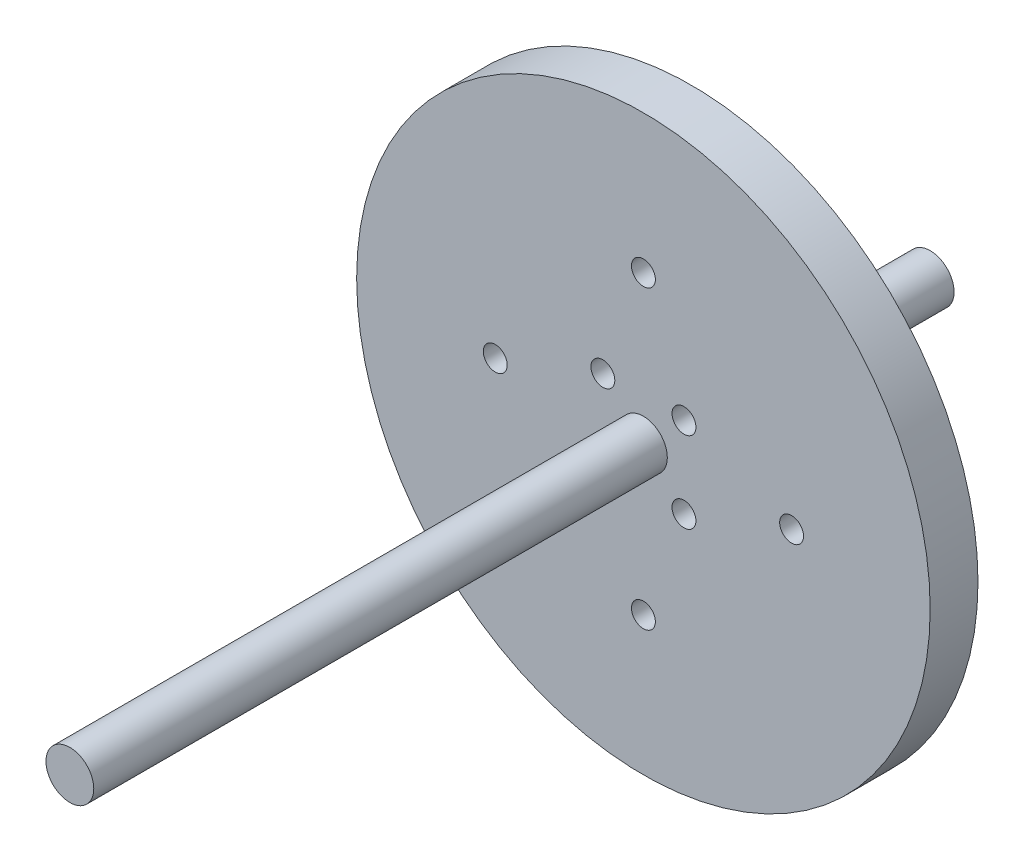
ISO-10303-21;
HEADER;
FILE_DESCRIPTION(('STEP AP214'),'2;1');
FILE_NAME('part.step','',(''),(''),'','','');
FILE_SCHEMA(('AUTOMOTIVE_DESIGN { 1 0 10303 214 1 1 1 1 }'));
ENDSEC;
DATA;
#1=APPLICATION_CONTEXT('core data for automotive mechanical design processes');
#2=APPLICATION_PROTOCOL_DEFINITION('international standard','automotive_design',2000,#1);
#3=PRODUCT_CONTEXT('',#1,'mechanical');
#4=PRODUCT('Part','Part','',(#3));
#5=PRODUCT_RELATED_PRODUCT_CATEGORY('part','',(#4));
#6=PRODUCT_DEFINITION_FORMATION('','',#4);
#7=PRODUCT_DEFINITION_CONTEXT('part definition',#1,'design');
#8=PRODUCT_DEFINITION('design','',#6,#7);
#9=PRODUCT_DEFINITION_SHAPE('','',#8);
#10=(LENGTH_UNIT() NAMED_UNIT(*) SI_UNIT(.MILLI.,.METRE.));
#11=(NAMED_UNIT(*) PLANE_ANGLE_UNIT() SI_UNIT($,.RADIAN.));
#12=(NAMED_UNIT(*) SI_UNIT($,.STERADIAN.) SOLID_ANGLE_UNIT());
#13=UNCERTAINTY_MEASURE_WITH_UNIT(LENGTH_MEASURE(1.E-05),#10,'distance_accuracy_value','');
#14=(GEOMETRIC_REPRESENTATION_CONTEXT(3) GLOBAL_UNCERTAINTY_ASSIGNED_CONTEXT((#13)) GLOBAL_UNIT_ASSIGNED_CONTEXT((#10,
#11,#12)) REPRESENTATION_CONTEXT('',''));
#15=CARTESIAN_POINT('',(0.,0.,0.));
#16=DIRECTION('',(0.,0.,1.));
#17=DIRECTION('',(1.,0.,0.));
#18=AXIS2_PLACEMENT_3D('',#15,#16,#17);
#19=CARTESIAN_POINT('',(0.,0.,5.));
#20=DIRECTION('',(0.,0.,-1.));
#21=DIRECTION('',(-1.,0.,0.));
#22=AXIS2_PLACEMENT_3D('',#19,#20,#21);
#23=CYLINDRICAL_SURFACE('',#22,30.);
#24=CARTESIAN_POINT('',(0.,0.,5.));
#25=DIRECTION('',(0.,0.,1.));
#26=DIRECTION('',(1.,0.,0.));
#27=AXIS2_PLACEMENT_3D('',#24,#25,#26);
#28=CIRCLE('',#27,30.);
#29=CARTESIAN_POINT('',(30.,0.,5.));
#30=VERTEX_POINT('',#29);
#31=EDGE_CURVE('E41',#30,#30,#28,.T.);
#32=ORIENTED_EDGE('',*,*,#31,.F.);
#33=EDGE_LOOP('',(#32));
#34=FACE_BOUND('',#33,.T.);
#35=CARTESIAN_POINT('',(0.,0.,0.));
#36=DIRECTION('',(0.,0.,1.));
#37=DIRECTION('',(1.,0.,0.));
#38=AXIS2_PLACEMENT_3D('',#35,#36,#37);
#39=CIRCLE('',#38,30.);
#40=CARTESIAN_POINT('',(30.,0.,0.));
#41=VERTEX_POINT('',#40);
#42=EDGE_CURVE('E45',#41,#41,#39,.T.);
#43=ORIENTED_EDGE('',*,*,#42,.T.);
#44=EDGE_LOOP('',(#43));
#45=FACE_BOUND('',#44,.T.);
#46=ADVANCED_FACE('F35',(#34,#45),#23,.T.);
#47=CARTESIAN_POINT('',(0.,0.,5.));
#48=DIRECTION('',(0.,0.,1.));
#49=DIRECTION('',(1.,0.,0.));
#50=AXIS2_PLACEMENT_3D('',#47,#48,#49);
#51=PLANE('',#50);
#52=CARTESIAN_POINT('',(0.,0.,5.));
#53=DIRECTION('',(0.,0.,1.));
#54=DIRECTION('',(1.,0.,0.));
#55=AXIS2_PLACEMENT_3D('',#52,#53,#54);
#56=CIRCLE('',#55,2.5);
#57=CARTESIAN_POINT('',(2.5,0.,5.));
#58=VERTEX_POINT('',#57);
#59=EDGE_CURVE('E103',#58,#58,#56,.T.);
#60=ORIENTED_EDGE('',*,*,#59,.F.);
#61=EDGE_LOOP('',(#60));
#62=FACE_BOUND('',#61,.T.);
#63=CARTESIAN_POINT('',(0.,15.5,5.));
#64=DIRECTION('',(0.,0.,1.));
#65=DIRECTION('',(1.,0.,0.));
#66=AXIS2_PLACEMENT_3D('',#63,#64,#65);
#67=CIRCLE('',#66,1.25);
#68=CARTESIAN_POINT('',(1.25,15.5,5.));
#69=VERTEX_POINT('',#68);
#70=EDGE_CURVE('E77',#69,#69,#67,.T.);
#71=ORIENTED_EDGE('',*,*,#70,.F.);
#72=EDGE_LOOP('',(#71));
#73=FACE_BOUND('',#72,.T.);
#74=CARTESIAN_POINT('',(-4.24264068711914,4.24264068711909,5.));
#75=DIRECTION('',(0.,0.,1.));
#76=DIRECTION('',(1.,0.,0.));
#77=AXIS2_PLACEMENT_3D('',#74,#75,#76);
#78=CIRCLE('',#77,1.25);
#79=CARTESIAN_POINT('',(-2.99264068711914,4.24264068711909,5.));
#80=VERTEX_POINT('',#79);
#81=EDGE_CURVE('E81',#80,#80,#78,.T.);
#82=ORIENTED_EDGE('',*,*,#81,.F.);
#83=EDGE_LOOP('',(#82));
#84=FACE_BOUND('',#83,.T.);
#85=CARTESIAN_POINT('',(-4.24264068711892,-4.24264068711931,5.));
#86=DIRECTION('',(0.,0.,1.));
#87=DIRECTION('',(1.,0.,0.));
#88=AXIS2_PLACEMENT_3D('',#85,#86,#87);
#89=CIRCLE('',#88,1.25);
#90=CARTESIAN_POINT('',(-2.99264068711892,-4.24264068711931,5.));
#91=VERTEX_POINT('',#90);
#92=EDGE_CURVE('E88',#91,#91,#89,.T.);
#93=ORIENTED_EDGE('',*,*,#92,.F.);
#94=EDGE_LOOP('',(#93));
#95=FACE_BOUND('',#94,.T.);
#96=CARTESIAN_POINT('',(4.24264068711948,-4.24264068711909,5.));
#97=DIRECTION('',(0.,0.,1.));
#98=DIRECTION('',(1.,0.,0.));
#99=AXIS2_PLACEMENT_3D('',#96,#97,#98);
#100=CIRCLE('',#99,1.25);
#101=CARTESIAN_POINT('',(5.49264068711948,-4.24264068711909,5.));
#102=VERTEX_POINT('',#101);
#103=EDGE_CURVE('E56',#102,#102,#100,.T.);
#104=ORIENTED_EDGE('',*,*,#103,.F.);
#105=EDGE_LOOP('',(#104));
#106=FACE_BOUND('',#105,.T.);
#107=CARTESIAN_POINT('',(-15.5,0.,5.));
#108=DIRECTION('',(0.,0.,1.));
#109=DIRECTION('',(1.,0.,0.));
#110=AXIS2_PLACEMENT_3D('',#107,#108,#109);
#111=CIRCLE('',#110,1.25);
#112=CARTESIAN_POINT('',(-14.25,0.,5.));
#113=VERTEX_POINT('',#112);
#114=EDGE_CURVE('E55',#113,#113,#111,.T.);
#115=ORIENTED_EDGE('',*,*,#114,.F.);
#116=EDGE_LOOP('',(#115));
#117=FACE_BOUND('',#116,.T.);
#118=CARTESIAN_POINT('',(0.,-15.5,5.));
#119=DIRECTION('',(0.,0.,1.));
#120=DIRECTION('',(1.,0.,0.));
#121=AXIS2_PLACEMENT_3D('',#118,#119,#120);
#122=CIRCLE('',#121,1.25);
#123=CARTESIAN_POINT('',(1.25000000000001,-15.5,5.));
#124=VERTEX_POINT('',#123);
#125=EDGE_CURVE('E62',#124,#124,#122,.T.);
#126=ORIENTED_EDGE('',*,*,#125,.F.);
#127=EDGE_LOOP('',(#126));
#128=FACE_BOUND('',#127,.T.);
#129=CARTESIAN_POINT('',(15.5,0.,5.));
#130=DIRECTION('',(0.,0.,1.));
#131=DIRECTION('',(1.,0.,0.));
#132=AXIS2_PLACEMENT_3D('',#129,#130,#131);
#133=CIRCLE('',#132,1.25);
#134=CARTESIAN_POINT('',(16.75,0.,5.));
#135=VERTEX_POINT('',#134);
#136=EDGE_CURVE('E68',#135,#135,#133,.T.);
#137=ORIENTED_EDGE('',*,*,#136,.F.);
#138=EDGE_LOOP('',(#137));
#139=FACE_BOUND('',#138,.T.);
#140=CARTESIAN_POINT('',(4.24264068711926,4.24264068711931,5.));
#141=DIRECTION('',(0.,0.,1.));
#142=DIRECTION('',(1.,0.,0.));
#143=AXIS2_PLACEMENT_3D('',#140,#141,#142);
#144=CIRCLE('',#143,1.25);
#145=CARTESIAN_POINT('',(5.49264068711926,4.24264068711931,5.));
#146=VERTEX_POINT('',#145);
#147=EDGE_CURVE('E74',#146,#146,#144,.T.);
#148=ORIENTED_EDGE('',*,*,#147,.F.);
#149=EDGE_LOOP('',(#148));
#150=FACE_BOUND('',#149,.T.);
#151=ORIENTED_EDGE('',*,*,#31,.T.);
#152=EDGE_LOOP('',(#151));
#153=FACE_BOUND('',#152,.T.);
#154=ADVANCED_FACE('F118',(#62,#73,#84,#95,#106,#117,#128,#139,#150,#153),#51,.T.);
#155=CARTESIAN_POINT('',(0.,0.,0.));
#156=DIRECTION('',(0.,0.,1.));
#157=DIRECTION('',(1.,0.,0.));
#158=AXIS2_PLACEMENT_3D('',#155,#156,#157);
#159=PLANE('',#158);
#160=CARTESIAN_POINT('',(0.,0.,0.));
#161=DIRECTION('',(0.,0.,1.));
#162=DIRECTION('',(1.,0.,0.));
#163=AXIS2_PLACEMENT_3D('',#160,#161,#162);
#164=CIRCLE('',#163,2.5);
#165=CARTESIAN_POINT('',(2.5,0.,0.));
#166=VERTEX_POINT('',#165);
#167=EDGE_CURVE('E10',#166,#166,#164,.F.);
#168=ORIENTED_EDGE('',*,*,#167,.F.);
#169=EDGE_LOOP('',(#168));
#170=FACE_BOUND('',#169,.T.);
#171=CARTESIAN_POINT('',(0.,15.5,0.));
#172=DIRECTION('',(0.,0.,1.));
#173=DIRECTION('',(1.,0.,0.));
#174=AXIS2_PLACEMENT_3D('',#171,#172,#173);
#175=CIRCLE('',#174,1.25);
#176=CARTESIAN_POINT('',(1.25,15.5,0.));
#177=VERTEX_POINT('',#176);
#178=EDGE_CURVE('E50',#177,#177,#175,.T.);
#179=ORIENTED_EDGE('',*,*,#178,.T.);
#180=EDGE_LOOP('',(#179));
#181=FACE_BOUND('',#180,.T.);
#182=CARTESIAN_POINT('',(-4.24264068711914,4.24264068711909,0.));
#183=DIRECTION('',(0.,0.,1.));
#184=DIRECTION('',(1.,0.,0.));
#185=AXIS2_PLACEMENT_3D('',#182,#183,#184);
#186=CIRCLE('',#185,1.25);
#187=CARTESIAN_POINT('',(-2.99264068711914,4.24264068711909,0.));
#188=VERTEX_POINT('',#187);
#189=EDGE_CURVE('E78',#188,#188,#186,.T.);
#190=ORIENTED_EDGE('',*,*,#189,.T.);
#191=EDGE_LOOP('',(#190));
#192=FACE_BOUND('',#191,.T.);
#193=CARTESIAN_POINT('',(-4.24264068711892,-4.24264068711931,0.));
#194=DIRECTION('',(0.,0.,1.));
#195=DIRECTION('',(1.,0.,0.));
#196=AXIS2_PLACEMENT_3D('',#193,#194,#195);
#197=CIRCLE('',#196,1.25);
#198=CARTESIAN_POINT('',(-2.99264068711892,-4.24264068711931,0.));
#199=VERTEX_POINT('',#198);
#200=EDGE_CURVE('E85',#199,#199,#197,.T.);
#201=ORIENTED_EDGE('',*,*,#200,.T.);
#202=EDGE_LOOP('',(#201));
#203=FACE_BOUND('',#202,.T.);
#204=CARTESIAN_POINT('',(4.24264068711948,-4.24264068711909,0.));
#205=DIRECTION('',(0.,0.,1.));
#206=DIRECTION('',(1.,0.,0.));
#207=AXIS2_PLACEMENT_3D('',#204,#205,#206);
#208=CIRCLE('',#207,1.25);
#209=CARTESIAN_POINT('',(5.49264068711948,-4.24264068711909,0.));
#210=VERTEX_POINT('',#209);
#211=EDGE_CURVE('E91',#210,#210,#208,.T.);
#212=ORIENTED_EDGE('',*,*,#211,.T.);
#213=EDGE_LOOP('',(#212));
#214=FACE_BOUND('',#213,.T.);
#215=CARTESIAN_POINT('',(-15.5,0.,0.));
#216=DIRECTION('',(0.,0.,1.));
#217=DIRECTION('',(1.,0.,0.));
#218=AXIS2_PLACEMENT_3D('',#215,#216,#217);
#219=CIRCLE('',#218,1.25);
#220=CARTESIAN_POINT('',(-14.25,0.,0.));
#221=VERTEX_POINT('',#220);
#222=EDGE_CURVE('E52',#221,#221,#219,.T.);
#223=ORIENTED_EDGE('',*,*,#222,.T.);
#224=EDGE_LOOP('',(#223));
#225=FACE_BOUND('',#224,.T.);
#226=CARTESIAN_POINT('',(0.,-15.5,0.));
#227=DIRECTION('',(0.,0.,1.));
#228=DIRECTION('',(1.,0.,0.));
#229=AXIS2_PLACEMENT_3D('',#226,#227,#228);
#230=CIRCLE('',#229,1.25);
#231=CARTESIAN_POINT('',(1.25000000000001,-15.5,0.));
#232=VERTEX_POINT('',#231);
#233=EDGE_CURVE('E59',#232,#232,#230,.T.);
#234=ORIENTED_EDGE('',*,*,#233,.T.);
#235=EDGE_LOOP('',(#234));
#236=FACE_BOUND('',#235,.T.);
#237=CARTESIAN_POINT('',(15.5,0.,0.));
#238=DIRECTION('',(0.,0.,1.));
#239=DIRECTION('',(1.,0.,0.));
#240=AXIS2_PLACEMENT_3D('',#237,#238,#239);
#241=CIRCLE('',#240,1.25);
#242=CARTESIAN_POINT('',(16.75,0.,0.));
#243=VERTEX_POINT('',#242);
#244=EDGE_CURVE('E65',#243,#243,#241,.T.);
#245=ORIENTED_EDGE('',*,*,#244,.T.);
#246=EDGE_LOOP('',(#245));
#247=FACE_BOUND('',#246,.T.);
#248=CARTESIAN_POINT('',(4.24264068711926,4.24264068711931,0.));
#249=DIRECTION('',(0.,0.,1.));
#250=DIRECTION('',(1.,0.,0.));
#251=AXIS2_PLACEMENT_3D('',#248,#249,#250);
#252=CIRCLE('',#251,1.25);
#253=CARTESIAN_POINT('',(5.49264068711926,4.24264068711931,0.));
#254=VERTEX_POINT('',#253);
#255=EDGE_CURVE('E71',#254,#254,#252,.T.);
#256=ORIENTED_EDGE('',*,*,#255,.T.);
#257=EDGE_LOOP('',(#256));
#258=FACE_BOUND('',#257,.T.);
#259=ORIENTED_EDGE('',*,*,#42,.F.);
#260=EDGE_LOOP('',(#259));
#261=FACE_BOUND('',#260,.T.);
#262=ADVANCED_FACE('F121',(#170,#181,#192,#203,#214,#225,#236,#247,#258,#261),#159,.F.);
#263=CARTESIAN_POINT('',(4.24264068711926,4.24264068711931,0.));
#264=DIRECTION('',(0.,0.,1.));
#265=DIRECTION('',(1.,0.,0.));
#266=AXIS2_PLACEMENT_3D('',#263,#264,#265);
#267=CYLINDRICAL_SURFACE('',#266,1.25);
#268=ORIENTED_EDGE('',*,*,#255,.F.);
#269=EDGE_LOOP('',(#268));
#270=FACE_BOUND('',#269,.T.);
#271=ORIENTED_EDGE('',*,*,#147,.T.);
#272=EDGE_LOOP('',(#271));
#273=FACE_BOUND('',#272,.T.);
#274=ADVANCED_FACE('F139',(#270,#273),#267,.F.);
#275=CARTESIAN_POINT('',(15.5,0.,0.));
#276=DIRECTION('',(0.,0.,1.));
#277=DIRECTION('',(1.,0.,0.));
#278=AXIS2_PLACEMENT_3D('',#275,#276,#277);
#279=CYLINDRICAL_SURFACE('',#278,1.25);
#280=ORIENTED_EDGE('',*,*,#244,.F.);
#281=EDGE_LOOP('',(#280));
#282=FACE_BOUND('',#281,.T.);
#283=ORIENTED_EDGE('',*,*,#136,.T.);
#284=EDGE_LOOP('',(#283));
#285=FACE_BOUND('',#284,.T.);
#286=ADVANCED_FACE('F141',(#282,#285),#279,.F.);
#287=CARTESIAN_POINT('',(0.,-15.5,0.));
#288=DIRECTION('',(0.,0.,1.));
#289=DIRECTION('',(1.,0.,0.));
#290=AXIS2_PLACEMENT_3D('',#287,#288,#289);
#291=CYLINDRICAL_SURFACE('',#290,1.25);
#292=ORIENTED_EDGE('',*,*,#233,.F.);
#293=EDGE_LOOP('',(#292));
#294=FACE_BOUND('',#293,.T.);
#295=ORIENTED_EDGE('',*,*,#125,.T.);
#296=EDGE_LOOP('',(#295));
#297=FACE_BOUND('',#296,.T.);
#298=ADVANCED_FACE('F148',(#294,#297),#291,.F.);
#299=CARTESIAN_POINT('',(-15.5,0.,0.));
#300=DIRECTION('',(0.,0.,1.));
#301=DIRECTION('',(1.,0.,0.));
#302=AXIS2_PLACEMENT_3D('',#299,#300,#301);
#303=CYLINDRICAL_SURFACE('',#302,1.25);
#304=ORIENTED_EDGE('',*,*,#222,.F.);
#305=EDGE_LOOP('',(#304));
#306=FACE_BOUND('',#305,.T.);
#307=ORIENTED_EDGE('',*,*,#114,.T.);
#308=EDGE_LOOP('',(#307));
#309=FACE_BOUND('',#308,.T.);
#310=ADVANCED_FACE('F252',(#306,#309),#303,.F.);
#311=CARTESIAN_POINT('',(4.24264068711948,-4.24264068711909,0.));
#312=DIRECTION('',(0.,0.,1.));
#313=DIRECTION('',(1.,0.,0.));
#314=AXIS2_PLACEMENT_3D('',#311,#312,#313);
#315=CYLINDRICAL_SURFACE('',#314,1.25);
#316=ORIENTED_EDGE('',*,*,#211,.F.);
#317=EDGE_LOOP('',(#316));
#318=FACE_BOUND('',#317,.T.);
#319=ORIENTED_EDGE('',*,*,#103,.T.);
#320=EDGE_LOOP('',(#319));
#321=FACE_BOUND('',#320,.T.);
#322=ADVANCED_FACE('F242',(#318,#321),#315,.F.);
#323=CARTESIAN_POINT('',(-4.24264068711892,-4.24264068711931,0.));
#324=DIRECTION('',(0.,0.,1.));
#325=DIRECTION('',(1.,0.,0.));
#326=AXIS2_PLACEMENT_3D('',#323,#324,#325);
#327=CYLINDRICAL_SURFACE('',#326,1.25);
#328=ORIENTED_EDGE('',*,*,#200,.F.);
#329=EDGE_LOOP('',(#328));
#330=FACE_BOUND('',#329,.T.);
#331=ORIENTED_EDGE('',*,*,#92,.T.);
#332=EDGE_LOOP('',(#331));
#333=FACE_BOUND('',#332,.T.);
#334=ADVANCED_FACE('F234',(#330,#333),#327,.F.);
#335=CARTESIAN_POINT('',(-4.24264068711914,4.24264068711909,0.));
#336=DIRECTION('',(0.,0.,1.));
#337=DIRECTION('',(1.,0.,0.));
#338=AXIS2_PLACEMENT_3D('',#335,#336,#337);
#339=CYLINDRICAL_SURFACE('',#338,1.25);
#340=ORIENTED_EDGE('',*,*,#189,.F.);
#341=EDGE_LOOP('',(#340));
#342=FACE_BOUND('',#341,.T.);
#343=ORIENTED_EDGE('',*,*,#81,.T.);
#344=EDGE_LOOP('',(#343));
#345=FACE_BOUND('',#344,.T.);
#346=ADVANCED_FACE('F225',(#342,#345),#339,.F.);
#347=CARTESIAN_POINT('',(0.,15.5,0.));
#348=DIRECTION('',(0.,0.,1.));
#349=DIRECTION('',(1.,0.,0.));
#350=AXIS2_PLACEMENT_3D('',#347,#348,#349);
#351=CYLINDRICAL_SURFACE('',#350,1.25);
#352=ORIENTED_EDGE('',*,*,#178,.F.);
#353=EDGE_LOOP('',(#352));
#354=FACE_BOUND('',#353,.T.);
#355=ORIENTED_EDGE('',*,*,#70,.T.);
#356=EDGE_LOOP('',(#355));
#357=FACE_BOUND('',#356,.T.);
#358=ADVANCED_FACE('F179',(#354,#357),#351,.F.);
#359=CARTESIAN_POINT('',(0.,0.,-25.));
#360=DIRECTION('',(0.,0.,1.));
#361=DIRECTION('',(1.,0.,0.));
#362=AXIS2_PLACEMENT_3D('',#359,#360,#361);
#363=CYLINDRICAL_SURFACE('',#362,2.5);
#364=CARTESIAN_POINT('',(0.,0.,-25.));
#365=DIRECTION('',(0.,0.,-1.));
#366=DIRECTION('',(-1.,0.,0.));
#367=AXIS2_PLACEMENT_3D('',#364,#365,#366);
#368=CIRCLE('',#367,2.5);
#369=CARTESIAN_POINT('',(-2.5,0.,-25.));
#370=VERTEX_POINT('',#369);
#371=EDGE_CURVE('E82',#370,#370,#368,.T.);
#372=ORIENTED_EDGE('',*,*,#371,.F.);
#373=EDGE_LOOP('',(#372));
#374=FACE_BOUND('',#373,.T.);
#375=ORIENTED_EDGE('',*,*,#167,.T.);
#376=EDGE_LOOP('',(#375));
#377=FACE_BOUND('',#376,.T.);
#378=ADVANCED_FACE('F184',(#374,#377),#363,.T.);
#379=CARTESIAN_POINT('',(0.,0.,-25.));
#380=DIRECTION('',(0.,0.,-1.));
#381=DIRECTION('',(-1.,0.,0.));
#382=AXIS2_PLACEMENT_3D('',#379,#380,#381);
#383=PLANE('',#382);
#384=ORIENTED_EDGE('',*,*,#371,.T.);
#385=EDGE_LOOP('',(#384));
#386=FACE_BOUND('',#385,.T.);
#387=ADVANCED_FACE('F114',(#386),#383,.T.);
#388=CARTESIAN_POINT('',(0.,0.,65.));
#389=DIRECTION('',(0.,0.,-1.));
#390=DIRECTION('',(-1.,0.,0.));
#391=AXIS2_PLACEMENT_3D('',#388,#389,#390);
#392=CYLINDRICAL_SURFACE('',#391,2.5);
#393=CARTESIAN_POINT('',(0.,0.,65.));
#394=DIRECTION('',(0.,0.,1.));
#395=DIRECTION('',(1.,0.,0.));
#396=AXIS2_PLACEMENT_3D('',#393,#394,#395);
#397=CIRCLE('',#396,2.5);
#398=CARTESIAN_POINT('',(2.5,0.,65.));
#399=VERTEX_POINT('',#398);
#400=EDGE_CURVE('E102',#399,#399,#397,.T.);
#401=ORIENTED_EDGE('',*,*,#400,.F.);
#402=EDGE_LOOP('',(#401));
#403=FACE_BOUND('',#402,.T.);
#404=ORIENTED_EDGE('',*,*,#59,.T.);
#405=EDGE_LOOP('',(#404));
#406=FACE_BOUND('',#405,.T.);
#407=ADVANCED_FACE('F111',(#403,#406),#392,.T.);
#408=CARTESIAN_POINT('',(0.,0.,65.));
#409=DIRECTION('',(0.,0.,1.));
#410=DIRECTION('',(1.,0.,0.));
#411=AXIS2_PLACEMENT_3D('',#408,#409,#410);
#412=PLANE('',#411);
#413=ORIENTED_EDGE('',*,*,#400,.T.);
#414=EDGE_LOOP('',(#413));
#415=FACE_BOUND('',#414,.T.);
#416=ADVANCED_FACE('F109',(#415),#412,.T.);
#417=CLOSED_SHELL('',(#46,#154,#262,#274,#286,#298,#310,#322,#334,#346,#358,#378,#387,#407,#416));
#418=MANIFOLD_SOLID_BREP('B2',#417);
#419=ADVANCED_BREP_SHAPE_REPRESENTATION('',(#18,#418),#14);
#420=SHAPE_DEFINITION_REPRESENTATION(#9,#419);
ENDSEC;
END-ISO-10303-21;
